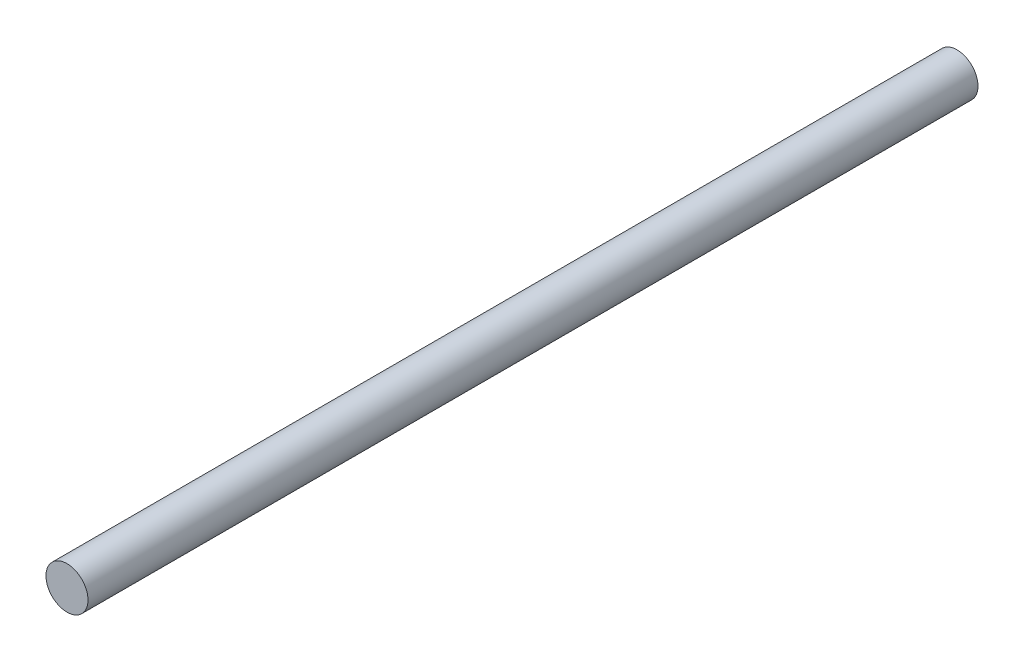
ISO-10303-21;
HEADER;
FILE_DESCRIPTION(('STEP AP214'),'2;1');
FILE_NAME('part.step','',(''),(''),'','','');
FILE_SCHEMA(('AUTOMOTIVE_DESIGN { 1 0 10303 214 1 1 1 1 }'));
ENDSEC;
DATA;
#1=APPLICATION_CONTEXT('core data for automotive mechanical design processes');
#2=APPLICATION_PROTOCOL_DEFINITION('international standard','automotive_design',2000,#1);
#3=PRODUCT_CONTEXT('',#1,'mechanical');
#4=PRODUCT('Part','Part','',(#3));
#5=PRODUCT_RELATED_PRODUCT_CATEGORY('part','',(#4));
#6=PRODUCT_DEFINITION_FORMATION('','',#4);
#7=PRODUCT_DEFINITION_CONTEXT('part definition',#1,'design');
#8=PRODUCT_DEFINITION('design','',#6,#7);
#9=PRODUCT_DEFINITION_SHAPE('','',#8);
#10=(LENGTH_UNIT() NAMED_UNIT(*) SI_UNIT(.MILLI.,.METRE.));
#11=(NAMED_UNIT(*) PLANE_ANGLE_UNIT() SI_UNIT($,.RADIAN.));
#12=(NAMED_UNIT(*) SI_UNIT($,.STERADIAN.) SOLID_ANGLE_UNIT());
#13=UNCERTAINTY_MEASURE_WITH_UNIT(LENGTH_MEASURE(1.E-05),#10,'distance_accuracy_value','');
#14=(GEOMETRIC_REPRESENTATION_CONTEXT(3) GLOBAL_UNCERTAINTY_ASSIGNED_CONTEXT((#13)) GLOBAL_UNIT_ASSIGNED_CONTEXT((#10,
#11,#12)) REPRESENTATION_CONTEXT('',''));
#15=CARTESIAN_POINT('',(0.,0.,0.));
#16=DIRECTION('',(0.,0.,1.));
#17=DIRECTION('',(1.,0.,0.));
#18=AXIS2_PLACEMENT_3D('',#15,#16,#17);
#19=CARTESIAN_POINT('',(0.,0.,127.));
#20=DIRECTION('',(0.,0.,-1.));
#21=DIRECTION('',(-1.,0.,0.));
#22=AXIS2_PLACEMENT_3D('',#19,#20,#21);
#23=CYLINDRICAL_SURFACE('',#22,3.);
#24=CARTESIAN_POINT('',(0.,0.,127.));
#25=DIRECTION('',(0.,0.,1.));
#26=DIRECTION('',(1.,0.,0.));
#27=AXIS2_PLACEMENT_3D('',#24,#25,#26);
#28=CIRCLE('',#27,3.);
#29=CARTESIAN_POINT('',(3.,0.,127.));
#30=VERTEX_POINT('',#29);
#31=EDGE_CURVE('E10',#30,#30,#28,.T.);
#32=ORIENTED_EDGE('',*,*,#31,.F.);
#33=EDGE_LOOP('',(#32));
#34=FACE_BOUND('',#33,.T.);
#35=CARTESIAN_POINT('',(0.,0.,0.));
#36=DIRECTION('',(0.,0.,1.));
#37=DIRECTION('',(1.,0.,0.));
#38=AXIS2_PLACEMENT_3D('',#35,#36,#37);
#39=CIRCLE('',#38,3.);
#40=CARTESIAN_POINT('',(3.,0.,0.));
#41=VERTEX_POINT('',#40);
#42=EDGE_CURVE('E33',#41,#41,#39,.T.);
#43=ORIENTED_EDGE('',*,*,#42,.T.);
#44=EDGE_LOOP('',(#43));
#45=FACE_BOUND('',#44,.T.);
#46=ADVANCED_FACE('F30',(#34,#45),#23,.T.);
#47=CARTESIAN_POINT('',(0.,0.,127.));
#48=DIRECTION('',(0.,0.,1.));
#49=DIRECTION('',(1.,0.,0.));
#50=AXIS2_PLACEMENT_3D('',#47,#48,#49);
#51=PLANE('',#50);
#52=ORIENTED_EDGE('',*,*,#31,.T.);
#53=EDGE_LOOP('',(#52));
#54=FACE_BOUND('',#53,.T.);
#55=ADVANCED_FACE('F45',(#54),#51,.T.);
#56=CARTESIAN_POINT('',(0.,0.,0.));
#57=DIRECTION('',(0.,0.,1.));
#58=DIRECTION('',(1.,0.,0.));
#59=AXIS2_PLACEMENT_3D('',#56,#57,#58);
#60=PLANE('',#59);
#61=ORIENTED_EDGE('',*,*,#42,.F.);
#62=EDGE_LOOP('',(#61));
#63=FACE_BOUND('',#62,.T.);
#64=ADVANCED_FACE('F43',(#63),#60,.F.);
#65=CLOSED_SHELL('',(#46,#55,#64));
#66=MANIFOLD_SOLID_BREP('B2',#65);
#67=ADVANCED_BREP_SHAPE_REPRESENTATION('',(#18,#66),#14);
#68=SHAPE_DEFINITION_REPRESENTATION(#9,#67);
ENDSEC;
END-ISO-10303-21;
